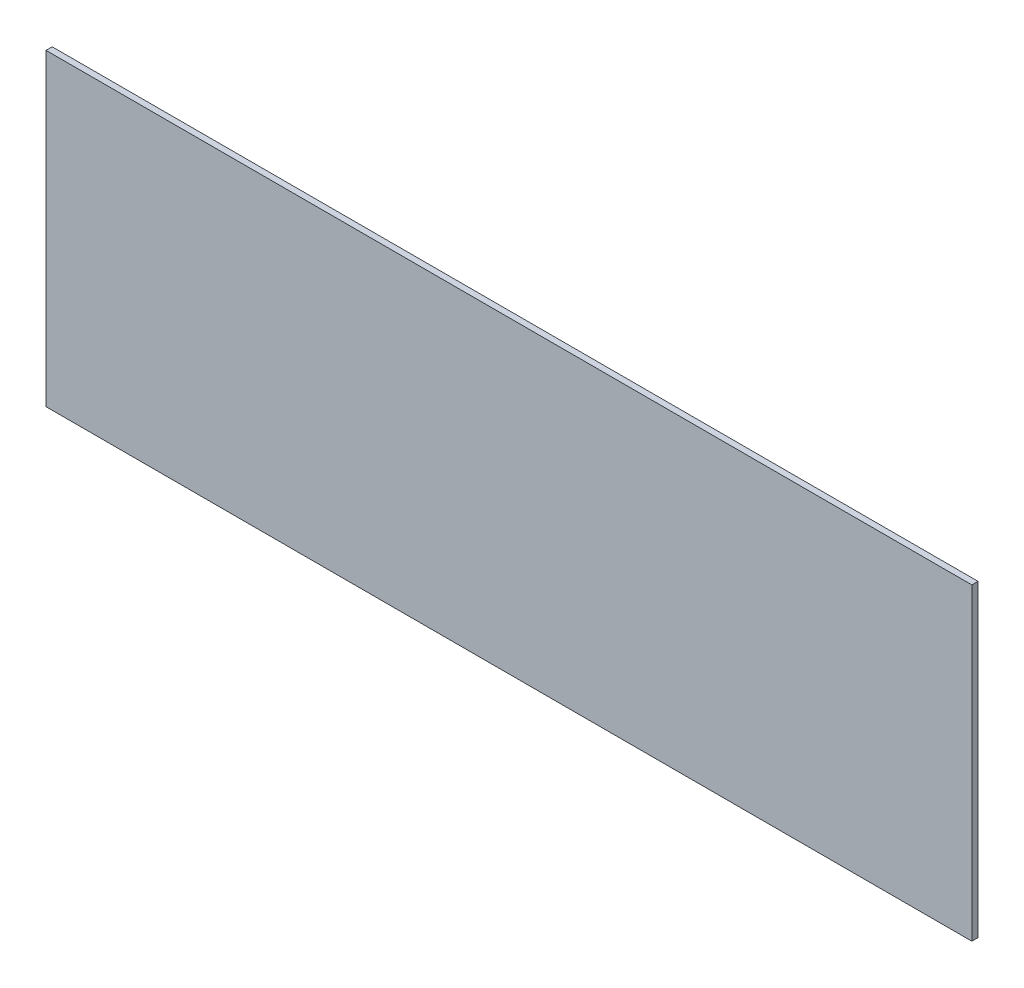
ISO-10303-21;
HEADER;
FILE_DESCRIPTION(('STEP AP214'),'2;1');
FILE_NAME('part.step','',(''),(''),'','','');
FILE_SCHEMA(('AUTOMOTIVE_DESIGN { 1 0 10303 214 1 1 1 1 }'));
ENDSEC;
DATA;
#1=APPLICATION_CONTEXT('core data for automotive mechanical design processes');
#2=APPLICATION_PROTOCOL_DEFINITION('international standard','automotive_design',2000,#1);
#3=PRODUCT_CONTEXT('',#1,'mechanical');
#4=PRODUCT('Part','Part','',(#3));
#5=PRODUCT_RELATED_PRODUCT_CATEGORY('part','',(#4));
#6=PRODUCT_DEFINITION_FORMATION('','',#4);
#7=PRODUCT_DEFINITION_CONTEXT('part definition',#1,'design');
#8=PRODUCT_DEFINITION('design','',#6,#7);
#9=PRODUCT_DEFINITION_SHAPE('','',#8);
#10=(LENGTH_UNIT() NAMED_UNIT(*) SI_UNIT(.MILLI.,.METRE.));
#11=(NAMED_UNIT(*) PLANE_ANGLE_UNIT() SI_UNIT($,.RADIAN.));
#12=(NAMED_UNIT(*) SI_UNIT($,.STERADIAN.) SOLID_ANGLE_UNIT());
#13=UNCERTAINTY_MEASURE_WITH_UNIT(LENGTH_MEASURE(1.E-05),#10,'distance_accuracy_value','');
#14=(GEOMETRIC_REPRESENTATION_CONTEXT(3) GLOBAL_UNCERTAINTY_ASSIGNED_CONTEXT((#13)) GLOBAL_UNIT_ASSIGNED_CONTEXT((#10,
#11,#12)) REPRESENTATION_CONTEXT('',''));
#15=CARTESIAN_POINT('',(0.,0.,0.));
#16=DIRECTION('',(0.,0.,1.));
#17=DIRECTION('',(1.,0.,0.));
#18=AXIS2_PLACEMENT_3D('',#15,#16,#17);
#19=CARTESIAN_POINT('',(37.5,12.5,0.5));
#20=DIRECTION('',(-1.,0.,0.));
#21=DIRECTION('',(0.,0.,1.));
#22=AXIS2_PLACEMENT_3D('',#19,#20,#21);
#23=PLANE('',#22);
#24=DIRECTION('',(0.,1.,0.));
#25=VECTOR('',#24,1.);
#26=CARTESIAN_POINT('',(37.5,12.5,0.));
#27=LINE('',#26,#25);
#28=CARTESIAN_POINT('',(37.5,-12.5,0.));
#29=VERTEX_POINT('',#28);
#30=CARTESIAN_POINT('',(37.5,12.5,0.));
#31=VERTEX_POINT('',#30);
#32=EDGE_CURVE('E98',#29,#31,#27,.T.);
#33=ORIENTED_EDGE('',*,*,#32,.T.);
#34=DIRECTION('',(0.,0.,-1.));
#35=VECTOR('',#34,1.);
#36=CARTESIAN_POINT('',(37.5,12.5,0.5));
#37=LINE('',#36,#35);
#38=CARTESIAN_POINT('',(37.5,12.5,0.5));
#39=VERTEX_POINT('',#38);
#40=EDGE_CURVE('E11',#39,#31,#37,.T.);
#41=ORIENTED_EDGE('',*,*,#40,.F.);
#42=DIRECTION('',(0.,1.,0.));
#43=VECTOR('',#42,1.);
#44=CARTESIAN_POINT('',(37.5,12.5,0.5));
#45=LINE('',#44,#43);
#46=CARTESIAN_POINT('',(37.5,-12.5,0.5));
#47=VERTEX_POINT('',#46);
#48=EDGE_CURVE('E86',#47,#39,#45,.T.);
#49=ORIENTED_EDGE('',*,*,#48,.F.);
#50=DIRECTION('',(0.,0.,-1.));
#51=VECTOR('',#50,1.);
#52=CARTESIAN_POINT('',(37.5,-12.5,0.5));
#53=LINE('',#52,#51);
#54=EDGE_CURVE('E94',#47,#29,#53,.T.);
#55=ORIENTED_EDGE('',*,*,#54,.T.);
#56=EDGE_LOOP('',(#33,#41,#49,#55));
#57=FACE_BOUND('',#56,.T.);
#58=ADVANCED_FACE('F35',(#57),#23,.F.);
#59=CARTESIAN_POINT('',(-37.5,12.5,0.5));
#60=DIRECTION('',(0.,-1.,0.));
#61=DIRECTION('',(0.,0.,-1.));
#62=AXIS2_PLACEMENT_3D('',#59,#60,#61);
#63=PLANE('',#62);
#64=DIRECTION('',(-1.,0.,0.));
#65=VECTOR('',#64,1.);
#66=CARTESIAN_POINT('',(-37.5,12.5,0.));
#67=LINE('',#66,#65);
#68=CARTESIAN_POINT('',(-37.5,12.5,0.));
#69=VERTEX_POINT('',#68);
#70=EDGE_CURVE('E90',#31,#69,#67,.T.);
#71=ORIENTED_EDGE('',*,*,#70,.T.);
#72=DIRECTION('',(0.,0.,-1.));
#73=VECTOR('',#72,1.);
#74=CARTESIAN_POINT('',(-37.5,12.5,0.5));
#75=LINE('',#74,#73);
#76=CARTESIAN_POINT('',(-37.5,12.5,0.5));
#77=VERTEX_POINT('',#76);
#78=EDGE_CURVE('E43',#77,#69,#75,.T.);
#79=ORIENTED_EDGE('',*,*,#78,.F.);
#80=DIRECTION('',(-1.,0.,0.));
#81=VECTOR('',#80,1.);
#82=CARTESIAN_POINT('',(-37.5,12.5,0.5));
#83=LINE('',#82,#81);
#84=EDGE_CURVE('E81',#39,#77,#83,.T.);
#85=ORIENTED_EDGE('',*,*,#84,.F.);
#86=ORIENTED_EDGE('',*,*,#40,.T.);
#87=EDGE_LOOP('',(#71,#79,#85,#86));
#88=FACE_BOUND('',#87,.T.);
#89=ADVANCED_FACE('F89',(#88),#63,.F.);
#90=CARTESIAN_POINT('',(-37.5,12.5,0.5));
#91=DIRECTION('',(1.,0.,0.));
#92=DIRECTION('',(0.,1.,0.));
#93=AXIS2_PLACEMENT_3D('',#90,#91,#92);
#94=PLANE('',#93);
#95=DIRECTION('',(0.,-1.,0.));
#96=VECTOR('',#95,1.);
#97=CARTESIAN_POINT('',(-37.5,12.5,0.));
#98=LINE('',#97,#96);
#99=CARTESIAN_POINT('',(-37.5,-12.5,0.));
#100=VERTEX_POINT('',#99);
#101=EDGE_CURVE('E68',#69,#100,#98,.T.);
#102=ORIENTED_EDGE('',*,*,#101,.T.);
#103=DIRECTION('',(0.,0.,-1.));
#104=VECTOR('',#103,1.);
#105=CARTESIAN_POINT('',(-37.5,-12.5,0.5));
#106=LINE('',#105,#104);
#107=CARTESIAN_POINT('',(-37.5,-12.5,0.5));
#108=VERTEX_POINT('',#107);
#109=EDGE_CURVE('E91',#108,#100,#106,.T.);
#110=ORIENTED_EDGE('',*,*,#109,.F.);
#111=DIRECTION('',(0.,-1.,0.));
#112=VECTOR('',#111,1.);
#113=CARTESIAN_POINT('',(-37.5,12.5,0.5));
#114=LINE('',#113,#112);
#115=EDGE_CURVE('E84',#77,#108,#114,.T.);
#116=ORIENTED_EDGE('',*,*,#115,.F.);
#117=ORIENTED_EDGE('',*,*,#78,.T.);
#118=EDGE_LOOP('',(#102,#110,#116,#117));
#119=FACE_BOUND('',#118,.T.);
#120=ADVANCED_FACE('F92',(#119),#94,.F.);
#121=CARTESIAN_POINT('',(-37.5,-12.5,0.5));
#122=DIRECTION('',(0.,1.,0.));
#123=DIRECTION('',(0.,0.,1.));
#124=AXIS2_PLACEMENT_3D('',#121,#122,#123);
#125=PLANE('',#124);
#126=DIRECTION('',(1.,0.,0.));
#127=VECTOR('',#126,1.);
#128=CARTESIAN_POINT('',(-37.5,-12.5,0.));
#129=LINE('',#128,#127);
#130=EDGE_CURVE('E74',#100,#29,#129,.T.);
#131=ORIENTED_EDGE('',*,*,#130,.T.);
#132=ORIENTED_EDGE('',*,*,#54,.F.);
#133=DIRECTION('',(1.,0.,0.));
#134=VECTOR('',#133,1.);
#135=CARTESIAN_POINT('',(-37.5,-12.5,0.5));
#136=LINE('',#135,#134);
#137=EDGE_CURVE('E51',#108,#47,#136,.T.);
#138=ORIENTED_EDGE('',*,*,#137,.F.);
#139=ORIENTED_EDGE('',*,*,#109,.T.);
#140=EDGE_LOOP('',(#131,#132,#138,#139));
#141=FACE_BOUND('',#140,.T.);
#142=ADVANCED_FACE('F105',(#141),#125,.F.);
#143=CARTESIAN_POINT('',(0.,0.,0.5));
#144=DIRECTION('',(0.,0.,1.));
#145=DIRECTION('',(1.,0.,0.));
#146=AXIS2_PLACEMENT_3D('',#143,#144,#145);
#147=PLANE('',#146);
#148=ORIENTED_EDGE('',*,*,#48,.T.);
#149=ORIENTED_EDGE('',*,*,#84,.T.);
#150=ORIENTED_EDGE('',*,*,#115,.T.);
#151=ORIENTED_EDGE('',*,*,#137,.T.);
#152=EDGE_LOOP('',(#148,#149,#150,#151));
#153=FACE_BOUND('',#152,.T.);
#154=ADVANCED_FACE('F82',(#153),#147,.T.);
#155=CARTESIAN_POINT('',(0.,0.,0.));
#156=DIRECTION('',(0.,0.,1.));
#157=DIRECTION('',(1.,0.,0.));
#158=AXIS2_PLACEMENT_3D('',#155,#156,#157);
#159=PLANE('',#158);
#160=ORIENTED_EDGE('',*,*,#32,.F.);
#161=ORIENTED_EDGE('',*,*,#130,.F.);
#162=ORIENTED_EDGE('',*,*,#101,.F.);
#163=ORIENTED_EDGE('',*,*,#70,.F.);
#164=EDGE_LOOP('',(#160,#161,#162,#163));
#165=FACE_BOUND('',#164,.T.);
#166=ADVANCED_FACE('F108',(#165),#159,.F.);
#167=CLOSED_SHELL('',(#58,#89,#120,#142,#154,#166));
#168=MANIFOLD_SOLID_BREP('B2',#167);
#169=ADVANCED_BREP_SHAPE_REPRESENTATION('',(#18,#168),#14);
#170=SHAPE_DEFINITION_REPRESENTATION(#9,#169);
ENDSEC;
END-ISO-10303-21;
